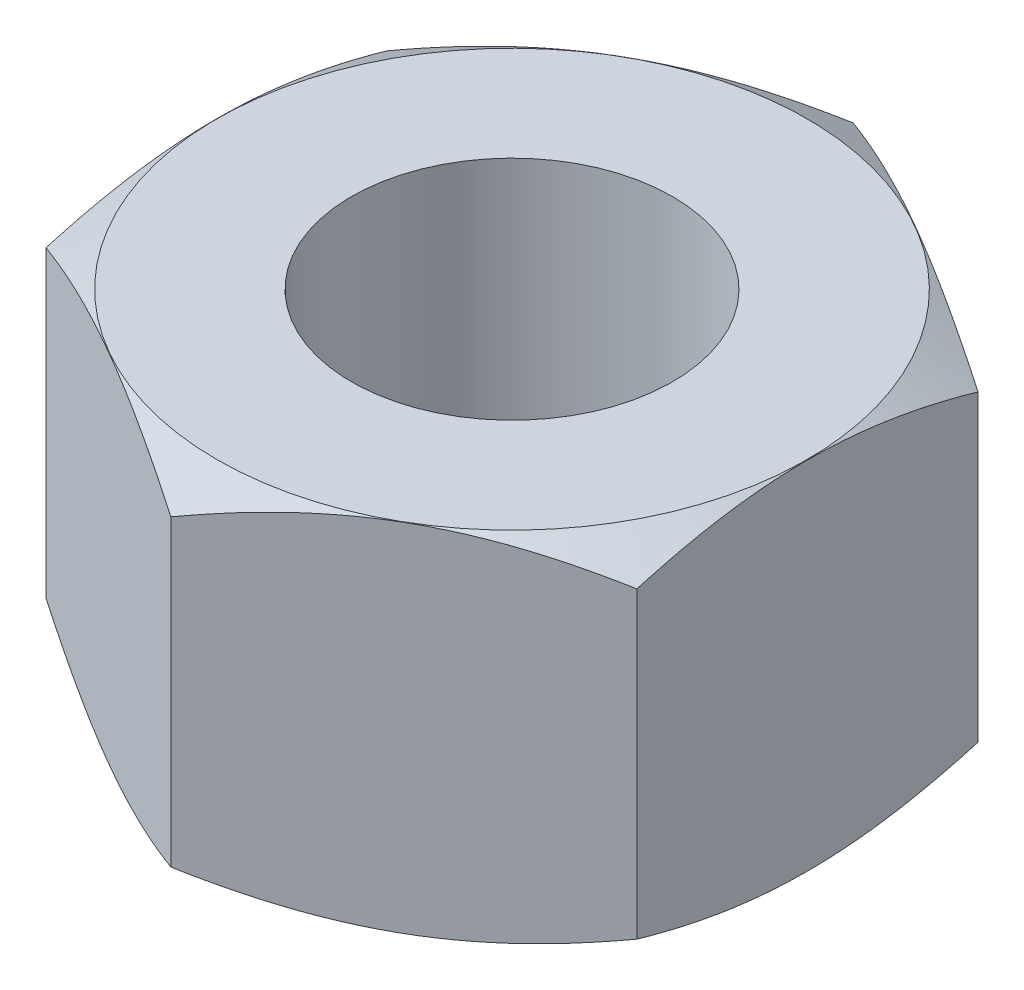
ISO-10303-21;
HEADER;
FILE_DESCRIPTION(('STEP AP214'),'2;1');
FILE_NAME('part.step','',(''),(''),'','','');
FILE_SCHEMA(('AUTOMOTIVE_DESIGN { 1 0 10303 214 1 1 1 1 }'));
ENDSEC;
DATA;
#1=APPLICATION_CONTEXT('core data for automotive mechanical design processes');
#2=APPLICATION_PROTOCOL_DEFINITION('international standard','automotive_design',2000,#1);
#3=PRODUCT_CONTEXT('',#1,'mechanical');
#4=PRODUCT('Part','Part','',(#3));
#5=PRODUCT_RELATED_PRODUCT_CATEGORY('part','',(#4));
#6=PRODUCT_DEFINITION_FORMATION('','',#4);
#7=PRODUCT_DEFINITION_CONTEXT('part definition',#1,'design');
#8=PRODUCT_DEFINITION('design','',#6,#7);
#9=PRODUCT_DEFINITION_SHAPE('','',#8);
#10=(LENGTH_UNIT() NAMED_UNIT(*) SI_UNIT(.MILLI.,.METRE.));
#11=(NAMED_UNIT(*) PLANE_ANGLE_UNIT() SI_UNIT($,.RADIAN.));
#12=(NAMED_UNIT(*) SI_UNIT($,.STERADIAN.) SOLID_ANGLE_UNIT());
#13=UNCERTAINTY_MEASURE_WITH_UNIT(LENGTH_MEASURE(1.E-05),#10,'distance_accuracy_value','');
#14=(GEOMETRIC_REPRESENTATION_CONTEXT(3) GLOBAL_UNCERTAINTY_ASSIGNED_CONTEXT((#13)) GLOBAL_UNIT_ASSIGNED_CONTEXT((#10,
#11,#12)) REPRESENTATION_CONTEXT('',''));
#15=CARTESIAN_POINT('',(0.,0.,0.));
#16=DIRECTION('',(0.,0.,1.));
#17=DIRECTION('',(1.,0.,0.));
#18=AXIS2_PLACEMENT_3D('',#15,#16,#17);
#19=CARTESIAN_POINT('',(0.,0.,0.));
#20=DIRECTION('',(0.,1.,0.));
#21=DIRECTION('',(0.,0.,1.));
#22=AXIS2_PLACEMENT_3D('',#19,#20,#21);
#23=CONICAL_SURFACE('',#22,7.7,1.0471975511966);
#24=CARTESIAN_POINT('',(0.,0.,0.));
#25=DIRECTION('',(0.,-1.,0.));
#26=DIRECTION('',(0.,0.,-1.));
#27=AXIS2_PLACEMENT_3D('',#24,#25,#26);
#28=CIRCLE('',#27,7.7);
#29=CARTESIAN_POINT('',(0.,0.,-7.7));
#30=VERTEX_POINT('',#29);
#31=EDGE_CURVE('E226',#30,#30,#28,.T.);
#32=ORIENTED_EDGE('',*,*,#31,.F.);
#33=EDGE_LOOP('',(#32));
#34=FACE_BOUND('',#33,.T.);
#35=CARTESIAN_POINT('',(-0.000200000000000209,0.692886990991615,-8.90011547005384));
#36=CARTESIAN_POINT('',(0.169222167899644,0.636421648760542,-8.80229953581029));
#37=CARTESIAN_POINT('',(0.339276001792091,0.582518917671602,-8.70411890903575));
#38=CARTESIAN_POINT('',(0.6807646868449,0.48054450654428,-8.5069603247953));
#39=CARTESIAN_POINT('',(0.852200100003986,0.432475341940828,-8.40798204285927));
#40=CARTESIAN_POINT('',(1.36925127631787,0.29796177962246,-8.10946240702964));
#41=CARTESIAN_POINT('',(1.71690807348494,0.221452160634334,-7.90874266159963));
#42=CARTESIAN_POINT('',(2.23716975291784,0.131735510096164,-7.60836944093));
#43=CARTESIAN_POINT('',(2.40822036386412,0.106177811090826,-7.50961332465511));
#44=CARTESIAN_POINT('',(2.75109513118736,0.063321833393041,-7.31165448544271));
#45=CARTESIAN_POINT('',(2.92291921786322,0.0460228249422022,-7.21245180274714));
#46=CARTESIAN_POINT('',(3.26686324908927,0.0201226451039089,-7.01387562373261));
#47=CARTESIAN_POINT('',(3.43898263481859,0.0115116028359858,-6.91450245004904));
#48=CARTESIAN_POINT('',(3.78338041287819,0.00317196678732889,-6.71566430017802));
#49=CARTESIAN_POINT('',(3.9556588001317,0.0034430985924934,-6.61619932692165));
#50=CARTESIAN_POINT('',(4.27773994586687,0.0122500453395684,-6.43024569073055));
#51=CARTESIAN_POINT('',(4.42756543182846,0.0197115208098528,-6.34374390607915));
#52=CARTESIAN_POINT('',(4.72686602512843,0.0412075728431838,-6.1709426279688));
#53=CARTESIAN_POINT('',(4.87634110685888,0.0552426156306021,-6.08464314929459));
#54=CARTESIAN_POINT('',(5.32418714905105,0.106876255042379,-5.82607911627943));
#55=CARTESIAN_POINT('',(5.62176538330737,0.153996930768511,-5.65427224262657));
#56=CARTESIAN_POINT('',(6.22007853959425,0.271799565487731,-5.30883598078465));
#57=CARTESIAN_POINT('',(6.52073710030243,0.342980894839996,-5.13525067982561));
#58=CARTESIAN_POINT('',(7.11757057411252,0.504533148507138,-4.79066871305998));
#59=CARTESIAN_POINT('',(7.4137531303935,0.594866127430669,-4.61966763446188));
#60=CARTESIAN_POINT('',(7.7078260936815,0.692886990991614,-4.44988452994616));
#61=B_SPLINE_CURVE_WITH_KNOTS('',3,(#35,#36,#37,#38,#39,#40,#41,#42,#43,#44,#45,#46,#47,#48,#49,
#50,#51,#52,#53,#54,#55,#56,#57,#58,#59,#60),.UNSPECIFIED.,.F.,.F.,(4,2,2,2,2,2,2,2,2,2,2,2,4),
(0.,0.610804246415455,1.22187094290096,2.44654344095257,3.04388117466782,3.64116611636473,
4.23777168271815,4.83435881700474,5.35372255660975,5.87312313720181,6.91266234673443,
7.97525670706933,9.03576508941966),.UNSPECIFIED.);
#62=CARTESIAN_POINT('',(0.,0.692820323027548,-8.9));
#63=VERTEX_POINT('',#62);
#64=CARTESIAN_POINT('',(7.7076260936815,0.692820323027549,-4.45));
#65=VERTEX_POINT('',#64);
#66=EDGE_CURVE('E91',#63,#65,#61,.T.);
#67=ORIENTED_EDGE('',*,*,#66,.T.);
#68=CARTESIAN_POINT('',(7.7076260936815,3.69241264911751,-11.8014451106687));
#69=CARTESIAN_POINT('',(7.7076260936815,3.52887986622969,-11.4630414887638));
#70=CARTESIAN_POINT('',(7.7076260936815,3.3669729208034,-11.1238377079909));
#71=CARTESIAN_POINT('',(7.7076260936815,3.04733978113838,-10.4433971593071));
#72=CARTESIAN_POINT('',(7.7076260936815,2.88961431089409,-10.1021600517051));
#73=CARTESIAN_POINT('',(7.7076260936815,2.57844215818103,-9.41537654310008));
#74=CARTESIAN_POINT('',(7.7076260936815,2.42502513245174,-9.06981665623875));
#75=CARTESIAN_POINT('',(7.7076260936815,2.12478158643834,-8.37585652400873));
#76=CARTESIAN_POINT('',(7.7076260936815,1.97795472256955,-8.02745642783886));
#77=CARTESIAN_POINT('',(7.7076260936815,1.69090202350008,-7.32293917269707));
#78=CARTESIAN_POINT('',(7.7076260936815,1.55077927487961,-6.9667797769286));
#79=CARTESIAN_POINT('',(7.7076260936815,1.28150958137545,-6.25026078017459));
#80=CARTESIAN_POINT('',(7.7076260936815,1.1523638577034,-5.88990071691609));
#81=CARTESIAN_POINT('',(7.7076260936815,0.908519279088907,-5.16514296841122));
#82=CARTESIAN_POINT('',(7.7076260936815,0.793789704835868,-4.80075573272563));
#83=CARTESIAN_POINT('',(7.7076260936815,0.582501973903968,-4.06681414162403));
#84=CARTESIAN_POINT('',(7.7076260936815,0.485938070152507,-3.6972614602836));
#85=CARTESIAN_POINT('',(7.7076260936815,0.315676961193567,-2.95267455951409));
#86=CARTESIAN_POINT('',(7.7076260936815,0.241985877049487,-2.57763890083715));
#87=CARTESIAN_POINT('',(7.7076260936815,0.152293998133902,-2.01178575991816));
#88=CARTESIAN_POINT('',(7.7076260936815,0.125868883431475,-1.82259488629562));
#89=CARTESIAN_POINT('',(7.7076260936815,0.0804868513507409,-1.4433263436088));
#90=CARTESIAN_POINT('',(7.7076260936815,0.0615291946454162,-1.25324876422057));
#91=CARTESIAN_POINT('',(7.7076260936815,0.0315922241749611,-0.873669165556705));
#92=CARTESIAN_POINT('',(7.7076260936815,0.0205633829760341,-0.68417106826483));
#93=CARTESIAN_POINT('',(7.7076260936815,0.00654234367085251,-0.304877883909034));
#94=CARTESIAN_POINT('',(7.7076260936815,0.00355004126504763,-0.115082800731434));
#95=CARTESIAN_POINT('',(7.7076260936815,0.00567337685537349,0.26440937703419));
#96=CARTESIAN_POINT('',(7.7076260936815,0.0107867401344757,0.454106484174179));
#97=CARTESIAN_POINT('',(7.7076260936815,0.0289942688970697,0.833119850132486));
#98=CARTESIAN_POINT('',(7.7076260936815,0.0420888327037642,1.02243608946942));
#99=CARTESIAN_POINT('',(7.7076260936815,0.0832268522752309,1.48129998203514));
#100=CARTESIAN_POINT('',(7.7076260936815,0.115270270522412,1.75049490260385));
#101=CARTESIAN_POINT('',(7.7076260936815,0.193715361207477,2.2868215142369));
#102=CARTESIAN_POINT('',(7.7076260936815,0.240120953171638,2.5539526216514));
#103=CARTESIAN_POINT('',(7.7076260936815,0.345644526759552,3.08593136598957));
#104=CARTESIAN_POINT('',(7.7076260936815,0.404774529542571,3.3507765955656));
#105=CARTESIAN_POINT('',(7.7076260936815,0.533942833656262,3.87774198044864));
#106=CARTESIAN_POINT('',(7.7076260936815,0.603980107299928,4.13986239000966));
#107=CARTESIAN_POINT('',(7.7076260936815,0.755117951796345,4.66783325817358));
#108=CARTESIAN_POINT('',(7.7076260936815,0.836447598500233,4.93361768761922));
#109=CARTESIAN_POINT('',(7.7076260936815,1.0071414293717,5.46237718554669));
#110=CARTESIAN_POINT('',(7.7076260936815,1.09650007130802,5.72535405385152));
#111=CARTESIAN_POINT('',(7.7076260936815,1.2814062113372,6.24744318728047));
#112=CARTESIAN_POINT('',(7.7076260936815,1.3769160410466,6.50656887365599));
#113=CARTESIAN_POINT('',(7.7076260936815,1.57354074367965,7.02280990118339));
#114=CARTESIAN_POINT('',(7.7076260936815,1.67465788248558,7.27992438101968));
#115=CARTESIAN_POINT('',(7.7076260936815,1.7780239607159,7.53610484965381));
#116=B_SPLINE_CURVE_WITH_KNOTS('',3,(#68,#69,#70,#71,#72,#73,#74,#75,#76,#77,#78,#79,#80,#81,
#82,#83,#84,#85,#86,#87,#88,#89,#90,#91,#92,#93,#94,#95,#96,#97,#98,#99,#100,#101,#102,#103,
#104,#105,#106,#107,#108,#109,#110,#111,#112,#113,#114,#115),.UNSPECIFIED.,.F.,.F.,(4,2,2,2,2,2,
2,2,2,2,2,2,2,2,2,2,2,2,2,2,2,2,2,4),(0.,1.12755219422506,2.2552983581379,3.38949922455345,
4.52364088941895,5.671696999624,6.81988066619319,7.96557461474846,9.1109054883236,
10.2565426035655,10.8295005906253,11.4024018368429,11.9716925984265,12.5409759716233,
13.1100996134175,13.6792516611785,14.4920847267267,15.3051398153559,16.1189664220592,
16.9327163960647,17.7664101699015,18.5995328214193,19.4279658340642,20.2567360865109),.UNSPECIFIED.);
#117=CARTESIAN_POINT('',(7.7076260936815,0.69282032302755,4.45));
#118=VERTEX_POINT('',#117);
#119=EDGE_CURVE('E190',#65,#118,#116,.T.);
#120=ORIENTED_EDGE('',*,*,#119,.T.);
#121=CARTESIAN_POINT('',(7.7078260936815,0.692886990991616,4.44988452994617));
#122=CARTESIAN_POINT('',(7.53840392578186,0.636421648760543,4.54770046418971));
#123=CARTESIAN_POINT('',(7.36835009188941,0.582518917671603,4.64588109096425));
#124=CARTESIAN_POINT('',(7.0268614068366,0.480544506544282,4.8430396752047));
#125=CARTESIAN_POINT('',(6.85542599367752,0.43247534194083,4.94201795714073));
#126=CARTESIAN_POINT('',(6.33837481736364,0.297961779622461,5.24053759297036));
#127=CARTESIAN_POINT('',(5.99071802019657,0.221452160634334,5.44125733840037));
#128=CARTESIAN_POINT('',(5.47045634076367,0.131735510096165,5.74163055907));
#129=CARTESIAN_POINT('',(5.29940572981738,0.106177811090828,5.84038667534489));
#130=CARTESIAN_POINT('',(4.95653096249414,0.0633218333930435,6.0383455145573));
#131=CARTESIAN_POINT('',(4.78470687581828,0.0460228249422039,6.13754819725286));
#132=CARTESIAN_POINT('',(4.44076284459223,0.0201226451039102,6.33612437626739));
#133=CARTESIAN_POINT('',(4.26864345886291,0.0115116028359876,6.43549754995096));
#134=CARTESIAN_POINT('',(3.92424568080331,0.00317196678733112,6.63433569982198));
#135=CARTESIAN_POINT('',(3.75196729354981,0.00344309859249552,6.73380067307835));
#136=CARTESIAN_POINT('',(3.42988614781463,0.0122500453395703,6.91975430926946));
#137=CARTESIAN_POINT('',(3.28006066185304,0.0197115208098546,7.00625609392085));
#138=CARTESIAN_POINT('',(2.98076006855307,0.0412075728431853,7.1790573720312));
#139=CARTESIAN_POINT('',(2.83128498682262,0.0552426156306034,7.26535685070541));
#140=CARTESIAN_POINT('',(2.38343894463045,0.10687625504238,7.52392088372057));
#141=CARTESIAN_POINT('',(2.08586071037413,0.153996930768512,7.69572775737343));
#142=CARTESIAN_POINT('',(1.48754755408726,0.271799565487733,8.04116401921535));
#143=CARTESIAN_POINT('',(1.18688899337908,0.342980894839997,8.21474932017439));
#144=CARTESIAN_POINT('',(0.590055519568988,0.504533148507138,8.55933128694002));
#145=CARTESIAN_POINT('',(0.293872963288004,0.594866127430669,8.73033236553812));
#146=CARTESIAN_POINT('',(-0.000199999999995418,0.692886990991615,8.90011547005384));
#147=B_SPLINE_CURVE_WITH_KNOTS('',3,(#121,#122,#123,#124,#125,#126,#127,#128,#129,#130,#131,
#132,#133,#134,#135,#136,#137,#138,#139,#140,#141,#142,#143,#144,#145,#146),.UNSPECIFIED.,.F.,
.F.,(4,2,2,2,2,2,2,2,2,2,2,2,4),(0.,0.610804246415454,1.22187094290096,2.44654344095257,
3.04388117466782,3.64116611636473,4.23777168271816,4.83435881700474,5.35372255660975,
5.87312313720181,6.91266234673443,7.97525670706933,9.03576508941965),.UNSPECIFIED.);
#148=CARTESIAN_POINT('',(0.,0.692820323027549,8.9));
#149=VERTEX_POINT('',#148);
#150=EDGE_CURVE('E183',#118,#149,#147,.T.);
#151=ORIENTED_EDGE('',*,*,#150,.T.);
#152=CARTESIAN_POINT('',(0.000200000000003903,0.692886990991616,8.90011547005384));
#153=CARTESIAN_POINT('',(-0.16922216789964,0.636421648760543,8.80229953581029));
#154=CARTESIAN_POINT('',(-0.339276001792088,0.582518917671602,8.70411890903576));
#155=CARTESIAN_POINT('',(-0.680764686844897,0.480544506544281,8.5069603247953));
#156=CARTESIAN_POINT('',(-0.852200100003983,0.432475341940829,8.40798204285927));
#157=CARTESIAN_POINT('',(-1.36925127631786,0.29796177962246,8.10946240702964));
#158=CARTESIAN_POINT('',(-1.71690807348493,0.221452160634332,7.90874266159963));
#159=CARTESIAN_POINT('',(-2.23716975291783,0.131735510096163,7.60836944093));
#160=CARTESIAN_POINT('',(-2.40822036386412,0.106177811090826,7.50961332465511));
#161=CARTESIAN_POINT('',(-2.75109513118736,0.0633218333930418,7.31165448544271));
#162=CARTESIAN_POINT('',(-2.92291921786321,0.0460228249422021,7.21245180274714));
#163=CARTESIAN_POINT('',(-3.26686324908927,0.0201226451039084,7.01387562373261));
#164=CARTESIAN_POINT('',(-3.43898263481859,0.0115116028359858,6.91450245004904));
#165=CARTESIAN_POINT('',(-3.78338041287819,0.00317196678732892,6.71566430017802));
#166=CARTESIAN_POINT('',(-3.95565880013169,0.00344309859249301,6.61619932692165));
#167=CARTESIAN_POINT('',(-4.27773994586687,0.0122500453395676,6.43024569073055));
#168=CARTESIAN_POINT('',(-4.42756543182846,0.0197115208098519,6.34374390607916));
#169=CARTESIAN_POINT('',(-4.72686602512843,0.041207572843183,6.1709426279688));
#170=CARTESIAN_POINT('',(-4.87634110685888,0.0552426156306014,6.08464314929459));
#171=CARTESIAN_POINT('',(-5.32418714905105,0.106876255042379,5.82607911627943));
#172=CARTESIAN_POINT('',(-5.62176538330737,0.15399693076851,5.65427224262657));
#173=CARTESIAN_POINT('',(-6.22007853959424,0.27179956548773,5.30883598078465));
#174=CARTESIAN_POINT('',(-6.52073710030242,0.342980894839995,5.13525067982561));
#175=CARTESIAN_POINT('',(-7.11757057411251,0.504533148507137,4.79066871305998));
#176=CARTESIAN_POINT('',(-7.4137531303935,0.594866127430668,4.61966763446188));
#177=CARTESIAN_POINT('',(-7.7078260936815,0.692886990991613,4.44988452994616));
#178=B_SPLINE_CURVE_WITH_KNOTS('',3,(#152,#153,#154,#155,#156,#157,#158,#159,#160,#161,#162,
#163,#164,#165,#166,#167,#168,#169,#170,#171,#172,#173,#174,#175,#176,#177),.UNSPECIFIED.,.F.,
.F.,(4,2,2,2,2,2,2,2,2,2,2,2,4),(0.,0.610804246415455,1.22187094290096,2.44654344095257,
3.04388117466782,3.64116611636473,4.23777168271815,4.83435881700474,5.35372255660975,
5.87312313720182,6.91266234673444,7.97525670706934,9.03576508941966),.UNSPECIFIED.);
#179=CARTESIAN_POINT('',(-7.7076260936815,0.692820323027548,4.45));
#180=VERTEX_POINT('',#179);
#181=EDGE_CURVE('E112',#149,#180,#178,.T.);
#182=ORIENTED_EDGE('',*,*,#181,.T.);
#183=CARTESIAN_POINT('',(-7.70762609368151,3.69241264911751,-11.8014451106687));
#184=CARTESIAN_POINT('',(-7.7076260936815,3.52887986622969,-11.4630414887638));
#185=CARTESIAN_POINT('',(-7.7076260936815,3.3669729208034,-11.1238377079909));
#186=CARTESIAN_POINT('',(-7.7076260936815,3.04733978113838,-10.4433971593071));
#187=CARTESIAN_POINT('',(-7.7076260936815,2.8896143108941,-10.1021600517051));
#188=CARTESIAN_POINT('',(-7.7076260936815,2.57844215818103,-9.41537654310008));
#189=CARTESIAN_POINT('',(-7.7076260936815,2.42502513245174,-9.06981665623876));
#190=CARTESIAN_POINT('',(-7.7076260936815,2.12478158643835,-8.37585652400873));
#191=CARTESIAN_POINT('',(-7.7076260936815,1.97795472256955,-8.02745642783887));
#192=CARTESIAN_POINT('',(-7.7076260936815,1.69090202350008,-7.32293917269707));
#193=CARTESIAN_POINT('',(-7.7076260936815,1.55077927487961,-6.9667797769286));
#194=CARTESIAN_POINT('',(-7.7076260936815,1.28150958137545,-6.25026078017459));
#195=CARTESIAN_POINT('',(-7.7076260936815,1.1523638577034,-5.8899007169161));
#196=CARTESIAN_POINT('',(-7.7076260936815,0.908519279088908,-5.16514296841122));
#197=CARTESIAN_POINT('',(-7.7076260936815,0.793789704835868,-4.80075573272563));
#198=CARTESIAN_POINT('',(-7.7076260936815,0.582501973903968,-4.06681414162403));
#199=CARTESIAN_POINT('',(-7.7076260936815,0.485938070152507,-3.6972614602836));
#200=CARTESIAN_POINT('',(-7.7076260936815,0.315676961193568,-2.95267455951409));
#201=CARTESIAN_POINT('',(-7.7076260936815,0.241985877049488,-2.57763890083715));
#202=CARTESIAN_POINT('',(-7.7076260936815,0.152293998133903,-2.01178575991816));
#203=CARTESIAN_POINT('',(-7.7076260936815,0.125868883431476,-1.82259488629562));
#204=CARTESIAN_POINT('',(-7.7076260936815,0.0804868513507409,-1.4433263436088));
#205=CARTESIAN_POINT('',(-7.7076260936815,0.0615291946454161,-1.25324876422057));
#206=CARTESIAN_POINT('',(-7.7076260936815,0.031592224174961,-0.873669165556703));
#207=CARTESIAN_POINT('',(-7.7076260936815,0.020563382976034,-0.684171068264828));
#208=CARTESIAN_POINT('',(-7.7076260936815,0.00654234367085233,-0.304877883909033));
#209=CARTESIAN_POINT('',(-7.7076260936815,0.00355004126504741,-0.115082800731433));
#210=CARTESIAN_POINT('',(-7.7076260936815,0.00567337685537319,0.26440937703419));
#211=CARTESIAN_POINT('',(-7.7076260936815,0.0107867401344754,0.454106484174179));
#212=CARTESIAN_POINT('',(-7.7076260936815,0.0289942688970693,0.833119850132485));
#213=CARTESIAN_POINT('',(-7.7076260936815,0.0420888327037637,1.02243608946942));
#214=CARTESIAN_POINT('',(-7.7076260936815,0.0832268522752303,1.48129998203514));
#215=CARTESIAN_POINT('',(-7.7076260936815,0.115270270522412,1.75049490260385));
#216=CARTESIAN_POINT('',(-7.7076260936815,0.193715361207477,2.2868215142369));
#217=CARTESIAN_POINT('',(-7.7076260936815,0.240120953171637,2.55395262165139));
#218=CARTESIAN_POINT('',(-7.7076260936815,0.345644526759552,3.08593136598957));
#219=CARTESIAN_POINT('',(-7.7076260936815,0.40477452954257,3.3507765955656));
#220=CARTESIAN_POINT('',(-7.7076260936815,0.533942833656261,3.87774198044864));
#221=CARTESIAN_POINT('',(-7.7076260936815,0.603980107299927,4.13986239000965));
#222=CARTESIAN_POINT('',(-7.7076260936815,0.755117951796345,4.66783325817359));
#223=CARTESIAN_POINT('',(-7.7076260936815,0.836447598500234,4.93361768761922));
#224=CARTESIAN_POINT('',(-7.7076260936815,1.0071414293717,5.4623771855467));
#225=CARTESIAN_POINT('',(-7.7076260936815,1.09650007130802,5.72535405385153));
#226=CARTESIAN_POINT('',(-7.7076260936815,1.2814062113372,6.24744318728047));
#227=CARTESIAN_POINT('',(-7.7076260936815,1.3769160410466,6.506568873656));
#228=CARTESIAN_POINT('',(-7.7076260936815,1.57354074367965,7.02280990118339));
#229=CARTESIAN_POINT('',(-7.7076260936815,1.67465788248558,7.27992438101968));
#230=CARTESIAN_POINT('',(-7.7076260936815,1.7780239607159,7.53610484965381));
#231=B_SPLINE_CURVE_WITH_KNOTS('',3,(#183,#184,#185,#186,#187,#188,#189,#190,#191,#192,#193,
#194,#195,#196,#197,#198,#199,#200,#201,#202,#203,#204,#205,#206,#207,#208,#209,#210,#211,#212,
#213,#214,#215,#216,#217,#218,#219,#220,#221,#222,#223,#224,#225,#226,#227,#228,#229,#230),
.UNSPECIFIED.,.F.,.F.,(4,2,2,2,2,2,2,2,2,2,2,2,2,2,2,2,2,2,2,2,2,2,2,4),(0.,1.12755219422506,
2.2552983581379,3.38949922455345,4.52364088941894,5.67169699962399,6.81988066619319,
7.96557461474846,9.1109054883236,10.2565426035655,10.8295005906253,11.4024018368429,
11.9716925984265,12.5409759716233,13.1100996134175,13.6792516611785,14.4920847267267,
15.3051398153559,16.1189664220592,16.9327163960647,17.7664101699015,18.5995328214193,
19.4279658340642,20.2567360865109),.UNSPECIFIED.);
#232=CARTESIAN_POINT('',(-7.7076260936815,0.692820323027549,-4.45));
#233=VERTEX_POINT('',#232);
#234=EDGE_CURVE('E110',#180,#233,#231,.F.);
#235=ORIENTED_EDGE('',*,*,#234,.T.);
#236=CARTESIAN_POINT('',(-7.7078260936815,0.692886990991616,-4.44988452994616));
#237=CARTESIAN_POINT('',(-7.53840392578186,0.636421648760543,-4.54770046418971));
#238=CARTESIAN_POINT('',(-7.36835009188941,0.582518917671602,-4.64588109096424));
#239=CARTESIAN_POINT('',(-7.0268614068366,0.480544506544281,-4.84303967520469));
#240=CARTESIAN_POINT('',(-6.85542599367752,0.43247534194083,-4.94201795714073));
#241=CARTESIAN_POINT('',(-6.33837481736364,0.297961779622462,-5.24053759297036));
#242=CARTESIAN_POINT('',(-5.99071802019657,0.221452160634334,-5.44125733840037));
#243=CARTESIAN_POINT('',(-5.47045634076367,0.131735510096164,-5.74163055907));
#244=CARTESIAN_POINT('',(-5.29940572981738,0.106177811090827,-5.84038667534489));
#245=CARTESIAN_POINT('',(-4.95653096249414,0.0633218333930416,-6.03834551455729));
#246=CARTESIAN_POINT('',(-4.78470687581828,0.0460228249422022,-6.13754819725286));
#247=CARTESIAN_POINT('',(-4.44076284459223,0.0201226451039089,-6.33612437626739));
#248=CARTESIAN_POINT('',(-4.26864345886291,0.0115116028359867,-6.43549754995096));
#249=CARTESIAN_POINT('',(-3.92424568080331,0.00317196678733007,-6.63433569982198));
#250=CARTESIAN_POINT('',(-3.75196729354981,0.00344309859249415,-6.73380067307835));
#251=CARTESIAN_POINT('',(-3.42988614781463,0.0122500453395687,-6.91975430926945));
#252=CARTESIAN_POINT('',(-3.28006066185304,0.019711520809853,-7.00625609392084));
#253=CARTESIAN_POINT('',(-2.98076006855307,0.0412075728431836,-7.1790573720312));
#254=CARTESIAN_POINT('',(-2.83128498682262,0.0552426156306016,-7.26535685070541));
#255=CARTESIAN_POINT('',(-2.38343894463045,0.106876255042379,-7.52392088372057));
#256=CARTESIAN_POINT('',(-2.08586071037413,0.15399693076851,-7.69572775737343));
#257=CARTESIAN_POINT('',(-1.48754755408726,0.271799565487731,-8.04116401921535));
#258=CARTESIAN_POINT('',(-1.18688899337908,0.342980894839996,-8.21474932017439));
#259=CARTESIAN_POINT('',(-0.590055519568985,0.504533148507137,-8.55933128694002));
#260=CARTESIAN_POINT('',(-0.293872963288,0.594866127430668,-8.73033236553812));
#261=CARTESIAN_POINT('',(0.000199999999999285,0.692886990991615,-8.90011547005384));
#262=B_SPLINE_CURVE_WITH_KNOTS('',3,(#236,#237,#238,#239,#240,#241,#242,#243,#244,#245,#246,
#247,#248,#249,#250,#251,#252,#253,#254,#255,#256,#257,#258,#259,#260,#261),.UNSPECIFIED.,.F.,
.F.,(4,2,2,2,2,2,2,2,2,2,2,2,4),(0.,0.610804246415454,1.22187094290096,2.44654344095257,
3.04388117466782,3.64116611636474,4.23777168271816,4.83435881700474,5.35372255660975,
5.87312313720182,6.91266234673443,7.97525670706934,9.03576508941966),.UNSPECIFIED.);
#263=EDGE_CURVE('E96',#233,#63,#262,.T.);
#264=ORIENTED_EDGE('',*,*,#263,.T.);
#265=EDGE_LOOP('',(#67,#120,#151,#182,#235,#264));
#266=FACE_BOUND('',#265,.T.);
#267=ADVANCED_FACE('F35',(#34,#266),#23,.T.);
#268=CARTESIAN_POINT('',(0.,8.60717967697245,0.));
#269=DIRECTION('',(0.,-1.,0.));
#270=DIRECTION('',(0.,0.,-1.));
#271=AXIS2_PLACEMENT_3D('',#268,#269,#270);
#272=CONICAL_SURFACE('',#271,8.9,1.0471975511966);
#273=CARTESIAN_POINT('',(0.,9.3,0.));
#274=DIRECTION('',(0.,1.,0.));
#275=DIRECTION('',(0.,0.,1.));
#276=AXIS2_PLACEMENT_3D('',#273,#274,#275);
#277=CIRCLE('',#276,7.69999999999999);
#278=CARTESIAN_POINT('',(0.,9.3,7.69999999999999));
#279=VERTEX_POINT('',#278);
#280=EDGE_CURVE('E227',#279,#279,#277,.T.);
#281=ORIENTED_EDGE('',*,*,#280,.F.);
#282=EDGE_LOOP('',(#281));
#283=FACE_BOUND('',#282,.T.);
#284=CARTESIAN_POINT('',(-0.000199999999996097,8.60711300900839,8.90011547005384));
#285=CARTESIAN_POINT('',(0.169222167899648,8.66357835123946,8.80229953581029));
#286=CARTESIAN_POINT('',(0.339276001792095,8.7174810823284,8.70411890903576));
#287=CARTESIAN_POINT('',(0.680764686844904,8.81945549345572,8.50696032479531));
#288=CARTESIAN_POINT('',(0.85220010000399,8.86752465805917,8.40798204285927));
#289=CARTESIAN_POINT('',(1.36925127631787,9.00203822037754,8.10946240702964));
#290=CARTESIAN_POINT('',(1.71690807348494,9.07854783936567,7.90874266159963));
#291=CARTESIAN_POINT('',(2.23716975291784,9.16826448990383,7.60836944093));
#292=CARTESIAN_POINT('',(2.40822036386413,9.19382218890917,7.50961332465511));
#293=CARTESIAN_POINT('',(2.75109513118736,9.23667816660696,7.31165448544271));
#294=CARTESIAN_POINT('',(2.92291921786322,9.2539771750578,7.21245180274714));
#295=CARTESIAN_POINT('',(3.26686324908928,9.27987735489609,7.01387562373261));
#296=CARTESIAN_POINT('',(3.43898263481859,9.28848839716401,6.91450245004904));
#297=CARTESIAN_POINT('',(3.7833804128782,9.29682803321267,6.71566430017802));
#298=CARTESIAN_POINT('',(3.9556588001317,9.29655690140751,6.61619932692165));
#299=CARTESIAN_POINT('',(4.27773994586687,9.28774995466043,6.43024569073055));
#300=CARTESIAN_POINT('',(4.42756543182846,9.28028847919015,6.34374390607916));
#301=CARTESIAN_POINT('',(4.72686602512844,9.25879242715681,6.1709426279688));
#302=CARTESIAN_POINT('',(4.87634110685888,9.2447573843694,6.08464314929459));
#303=CARTESIAN_POINT('',(5.32418714905106,9.19312374495762,5.82607911627943));
#304=CARTESIAN_POINT('',(5.62176538330737,9.14600306923149,5.65427224262657));
#305=CARTESIAN_POINT('',(6.22007853959425,9.02820043451227,5.30883598078465));
#306=CARTESIAN_POINT('',(6.52073710030243,8.95701910516,5.13525067982562));
#307=CARTESIAN_POINT('',(7.11757057411252,8.79546685149286,4.79066871305998));
#308=CARTESIAN_POINT('',(7.4137531303935,8.70513387256933,4.61966763446188));
#309=CARTESIAN_POINT('',(7.7078260936815,8.60711300900839,4.44988452994616));
#310=B_SPLINE_CURVE_WITH_KNOTS('',3,(#284,#285,#286,#287,#288,#289,#290,#291,#292,#293,#294,
#295,#296,#297,#298,#299,#300,#301,#302,#303,#304,#305,#306,#307,#308,#309),.UNSPECIFIED.,.F.,
.F.,(4,2,2,2,2,2,2,2,2,2,2,2,4),(0.,0.610804246415454,1.22187094290096,2.44654344095257,
3.04388117466782,3.64116611636473,4.23777168271816,4.83435881700474,5.35372255660975,
5.87312313720181,6.91266234673443,7.97525670706933,9.03576508941965),.UNSPECIFIED.);
#311=CARTESIAN_POINT('',(0.,8.60717967697245,8.9));
#312=VERTEX_POINT('',#311);
#313=CARTESIAN_POINT('',(7.7076260936815,8.60717967697245,4.45));
#314=VERTEX_POINT('',#313);
#315=EDGE_CURVE('E49',#312,#314,#310,.T.);
#316=ORIENTED_EDGE('',*,*,#315,.T.);
#317=CARTESIAN_POINT('',(7.7076260936815,5.6075873508825,-11.8014451106687));
#318=CARTESIAN_POINT('',(7.7076260936815,5.77112013377031,-11.4630414887638));
#319=CARTESIAN_POINT('',(7.7076260936815,5.93302707919661,-11.1238377079909));
#320=CARTESIAN_POINT('',(7.7076260936815,6.25266021886163,-10.4433971593071));
#321=CARTESIAN_POINT('',(7.7076260936815,6.41038568910591,-10.1021600517051));
#322=CARTESIAN_POINT('',(7.7076260936815,6.72155784181898,-9.41537654310008));
#323=CARTESIAN_POINT('',(7.7076260936815,6.87497486754827,-9.06981665623875));
#324=CARTESIAN_POINT('',(7.7076260936815,7.17521841356166,-8.37585652400873));
#325=CARTESIAN_POINT('',(7.7076260936815,7.32204527743045,-8.02745642783886));
#326=CARTESIAN_POINT('',(7.7076260936815,7.60909797649992,-7.32293917269706));
#327=CARTESIAN_POINT('',(7.7076260936815,7.74922072512039,-6.9667797769286));
#328=CARTESIAN_POINT('',(7.7076260936815,8.01849041862455,-6.25026078017459));
#329=CARTESIAN_POINT('',(7.7076260936815,8.14763614229661,-5.88990071691609));
#330=CARTESIAN_POINT('',(7.7076260936815,8.39148072091109,-5.16514296841122));
#331=CARTESIAN_POINT('',(7.7076260936815,8.50621029516413,-4.80075573272563));
#332=CARTESIAN_POINT('',(7.7076260936815,8.71749802609603,-4.06681414162403));
#333=CARTESIAN_POINT('',(7.7076260936815,8.81406192984749,-3.6972614602836));
#334=CARTESIAN_POINT('',(7.7076260936815,8.98432303880643,-2.95267455951409));
#335=CARTESIAN_POINT('',(7.7076260936815,9.05801412295051,-2.57763890083715));
#336=CARTESIAN_POINT('',(7.7076260936815,9.1477060018661,-2.01178575991816));
#337=CARTESIAN_POINT('',(7.7076260936815,9.17413111656853,-1.82259488629562));
#338=CARTESIAN_POINT('',(7.7076260936815,9.21951314864926,-1.4433263436088));
#339=CARTESIAN_POINT('',(7.7076260936815,9.23847080535458,-1.25324876422057));
#340=CARTESIAN_POINT('',(7.7076260936815,9.26840777582504,-0.873669165556706));
#341=CARTESIAN_POINT('',(7.7076260936815,9.27943661702396,-0.684171068264831));
#342=CARTESIAN_POINT('',(7.7076260936815,9.29345765632915,-0.304877883909036));
#343=CARTESIAN_POINT('',(7.7076260936815,9.29644995873495,-0.115082800731435));
#344=CARTESIAN_POINT('',(7.7076260936815,9.29432662314463,0.264409377034188));
#345=CARTESIAN_POINT('',(7.7076260936815,9.28921325986552,0.454106484174178));
#346=CARTESIAN_POINT('',(7.7076260936815,9.27100573110293,0.833119850132485));
#347=CARTESIAN_POINT('',(7.7076260936815,9.25791116729624,1.02243608946942));
#348=CARTESIAN_POINT('',(7.7076260936815,9.21677314772477,1.48129998203514));
#349=CARTESIAN_POINT('',(7.7076260936815,9.18472972947759,1.75049490260385));
#350=CARTESIAN_POINT('',(7.7076260936815,9.10628463879252,2.2868215142369));
#351=CARTESIAN_POINT('',(7.7076260936815,9.05987904682836,2.5539526216514));
#352=CARTESIAN_POINT('',(7.7076260936815,8.95435547324045,3.08593136598958));
#353=CARTESIAN_POINT('',(7.7076260936815,8.89522547045743,3.3507765955656));
#354=CARTESIAN_POINT('',(7.7076260936815,8.76605716634374,3.87774198044865));
#355=CARTESIAN_POINT('',(7.7076260936815,8.69601989270007,4.13986239000966));
#356=CARTESIAN_POINT('',(7.7076260936815,8.54488204820365,4.66783325817359));
#357=CARTESIAN_POINT('',(7.7076260936815,8.46355240149976,4.93361768761923));
#358=CARTESIAN_POINT('',(7.7076260936815,8.29285857062829,5.4623771855467));
#359=CARTESIAN_POINT('',(7.7076260936815,8.20349992869198,5.72535405385153));
#360=CARTESIAN_POINT('',(7.7076260936815,8.0185937886628,6.24744318728048));
#361=CARTESIAN_POINT('',(7.7076260936815,7.9230839589534,6.50656887365601));
#362=CARTESIAN_POINT('',(7.7076260936815,7.72645925632035,7.0228099011834));
#363=CARTESIAN_POINT('',(7.7076260936815,7.62534211751442,7.27992438101969));
#364=CARTESIAN_POINT('',(7.7076260936815,7.52197603928409,7.53610484965382));
#365=B_SPLINE_CURVE_WITH_KNOTS('',3,(#317,#318,#319,#320,#321,#322,#323,#324,#325,#326,#327,
#328,#329,#330,#331,#332,#333,#334,#335,#336,#337,#338,#339,#340,#341,#342,#343,#344,#345,#346,
#347,#348,#349,#350,#351,#352,#353,#354,#355,#356,#357,#358,#359,#360,#361,#362,#363,#364),
.UNSPECIFIED.,.F.,.F.,(4,2,2,2,2,2,2,2,2,2,2,2,2,2,2,2,2,2,2,2,2,2,2,4),(0.,1.12755219422506,
2.2552983581379,3.38949922455345,4.52364088941895,5.671696999624,6.81988066619319,
7.96557461474846,9.11090548832359,10.2565426035655,10.8295005906253,11.4024018368429,
11.9716925984265,12.5409759716233,13.1100996134175,13.6792516611785,14.4920847267267,
15.3051398153559,16.1189664220592,16.9327163960647,17.7664101699015,18.5995328214193,
19.4279658340642,20.2567360865109),.UNSPECIFIED.);
#366=CARTESIAN_POINT('',(7.7076260936815,8.60717967697245,-4.45));
#367=VERTEX_POINT('',#366);
#368=EDGE_CURVE('E12',#314,#367,#365,.F.);
#369=ORIENTED_EDGE('',*,*,#368,.T.);
#370=CARTESIAN_POINT('',(7.7078260936815,8.60711300900839,-4.44988452994616));
#371=CARTESIAN_POINT('',(7.53840392578186,8.66357835123946,-4.54770046418971));
#372=CARTESIAN_POINT('',(7.36835009188941,8.7174810823284,-4.64588109096424));
#373=CARTESIAN_POINT('',(7.0268614068366,8.81945549345572,-4.84303967520469));
#374=CARTESIAN_POINT('',(6.85542599367752,8.86752465805917,-4.94201795714073));
#375=CARTESIAN_POINT('',(6.33837481736364,9.00203822037754,-5.24053759297036));
#376=CARTESIAN_POINT('',(5.99071802019657,9.07854783936567,-5.44125733840037));
#377=CARTESIAN_POINT('',(5.47045634076367,9.16826448990384,-5.74163055907));
#378=CARTESIAN_POINT('',(5.29940572981738,9.19382218890917,-5.84038667534489));
#379=CARTESIAN_POINT('',(4.95653096249414,9.23667816660696,-6.03834551455729));
#380=CARTESIAN_POINT('',(4.78470687581829,9.2539771750578,-6.13754819725286));
#381=CARTESIAN_POINT('',(4.44076284459223,9.27987735489609,-6.33612437626739));
#382=CARTESIAN_POINT('',(4.26864345886291,9.28848839716401,-6.43549754995096));
#383=CARTESIAN_POINT('',(3.92424568080331,9.29682803321267,-6.63433569982198));
#384=CARTESIAN_POINT('',(3.75196729354981,9.29655690140751,-6.73380067307835));
#385=CARTESIAN_POINT('',(3.42988614781463,9.28774995466043,-6.91975430926945));
#386=CARTESIAN_POINT('',(3.28006066185304,9.28028847919015,-7.00625609392084));
#387=CARTESIAN_POINT('',(2.98076006855307,9.25879242715682,-7.1790573720312));
#388=CARTESIAN_POINT('',(2.83128498682262,9.2447573843694,-7.26535685070541));
#389=CARTESIAN_POINT('',(2.38343894463045,9.19312374495762,-7.52392088372057));
#390=CARTESIAN_POINT('',(2.08586071037413,9.14600306923149,-7.69572775737343));
#391=CARTESIAN_POINT('',(1.48754755408726,9.02820043451227,-8.04116401921535));
#392=CARTESIAN_POINT('',(1.18688899337907,8.95701910516,-8.21474932017439));
#393=CARTESIAN_POINT('',(0.590055519568985,8.79546685149286,-8.55933128694002));
#394=CARTESIAN_POINT('',(0.293872963288,8.70513387256933,-8.73033236553812));
#395=CARTESIAN_POINT('',(-0.000199999999999588,8.60711300900839,-8.90011547005384));
#396=B_SPLINE_CURVE_WITH_KNOTS('',3,(#370,#371,#372,#373,#374,#375,#376,#377,#378,#379,#380,
#381,#382,#383,#384,#385,#386,#387,#388,#389,#390,#391,#392,#393,#394,#395),.UNSPECIFIED.,.F.,
.F.,(4,2,2,2,2,2,2,2,2,2,2,2,4),(0.,0.610804246415453,1.22187094290096,2.44654344095257,
3.04388117466782,3.64116611636473,4.23777168271815,4.83435881700474,5.35372255660975,
5.87312313720181,6.91266234673443,7.97525670706934,9.03576508941966),.UNSPECIFIED.);
#397=CARTESIAN_POINT('',(0.,8.60717967697245,-8.9));
#398=VERTEX_POINT('',#397);
#399=EDGE_CURVE('E148',#367,#398,#396,.T.);
#400=ORIENTED_EDGE('',*,*,#399,.T.);
#401=CARTESIAN_POINT('',(0.000200000000000144,8.60711300900839,-8.90011547005384));
#402=CARTESIAN_POINT('',(-0.169222167899643,8.66357835123946,-8.80229953581029));
#403=CARTESIAN_POINT('',(-0.339276001792091,8.7174810823284,-8.70411890903575));
#404=CARTESIAN_POINT('',(-0.6807646868449,8.81945549345572,-8.5069603247953));
#405=CARTESIAN_POINT('',(-0.852200100003986,8.86752465805917,-8.40798204285927));
#406=CARTESIAN_POINT('',(-1.36925127631787,9.00203822037754,-8.10946240702964));
#407=CARTESIAN_POINT('',(-1.71690807348494,9.07854783936567,-7.90874266159963));
#408=CARTESIAN_POINT('',(-2.23716975291783,9.16826448990384,-7.60836944093));
#409=CARTESIAN_POINT('',(-2.40822036386412,9.19382218890918,-7.50961332465511));
#410=CARTESIAN_POINT('',(-2.75109513118736,9.23667816660696,-7.31165448544271));
#411=CARTESIAN_POINT('',(-2.92291921786322,9.2539771750578,-7.21245180274714));
#412=CARTESIAN_POINT('',(-3.26686324908927,9.27987735489609,-7.01387562373261));
#413=CARTESIAN_POINT('',(-3.43898263481859,9.28848839716401,-6.91450245004904));
#414=CARTESIAN_POINT('',(-3.78338041287819,9.29682803321267,-6.71566430017802));
#415=CARTESIAN_POINT('',(-3.9556588001317,9.29655690140751,-6.61619932692165));
#416=CARTESIAN_POINT('',(-4.27773994586687,9.28774995466043,-6.43024569073055));
#417=CARTESIAN_POINT('',(-4.42756543182846,9.28028847919015,-6.34374390607916));
#418=CARTESIAN_POINT('',(-4.72686602512844,9.25879242715682,-6.1709426279688));
#419=CARTESIAN_POINT('',(-4.87634110685888,9.2447573843694,-6.08464314929459));
#420=CARTESIAN_POINT('',(-5.32418714905105,9.19312374495762,-5.82607911627943));
#421=CARTESIAN_POINT('',(-5.62176538330737,9.14600306923149,-5.65427224262657));
#422=CARTESIAN_POINT('',(-6.22007853959425,9.02820043451227,-5.30883598078465));
#423=CARTESIAN_POINT('',(-6.52073710030243,8.95701910516,-5.13525067982561));
#424=CARTESIAN_POINT('',(-7.11757057411252,8.79546685149286,-4.79066871305998));
#425=CARTESIAN_POINT('',(-7.4137531303935,8.70513387256933,-4.61966763446188));
#426=CARTESIAN_POINT('',(-7.7078260936815,8.60711300900839,-4.44988452994616));
#427=B_SPLINE_CURVE_WITH_KNOTS('',3,(#401,#402,#403,#404,#405,#406,#407,#408,#409,#410,#411,
#412,#413,#414,#415,#416,#417,#418,#419,#420,#421,#422,#423,#424,#425,#426),.UNSPECIFIED.,.F.,
.F.,(4,2,2,2,2,2,2,2,2,2,2,2,4),(0.,0.610804246415454,1.22187094290096,2.44654344095257,
3.04388117466782,3.64116611636474,4.23777168271815,4.83435881700474,5.35372255660975,
5.87312313720181,6.91266234673444,7.97525670706933,9.03576508941966),.UNSPECIFIED.);
#428=CARTESIAN_POINT('',(-7.7076260936815,8.60717967697245,-4.45));
#429=VERTEX_POINT('',#428);
#430=EDGE_CURVE('E104',#398,#429,#427,.T.);
#431=ORIENTED_EDGE('',*,*,#430,.T.);
#432=CARTESIAN_POINT('',(-7.70762609368151,5.6075873508825,-11.8014451106687));
#433=CARTESIAN_POINT('',(-7.7076260936815,5.77112013377031,-11.4630414887638));
#434=CARTESIAN_POINT('',(-7.7076260936815,5.9330270791966,-11.1238377079909));
#435=CARTESIAN_POINT('',(-7.7076260936815,6.25266021886163,-10.4433971593071));
#436=CARTESIAN_POINT('',(-7.7076260936815,6.41038568910591,-10.1021600517051));
#437=CARTESIAN_POINT('',(-7.7076260936815,6.72155784181897,-9.41537654310008));
#438=CARTESIAN_POINT('',(-7.7076260936815,6.87497486754827,-9.06981665623875));
#439=CARTESIAN_POINT('',(-7.7076260936815,7.17521841356166,-8.37585652400873));
#440=CARTESIAN_POINT('',(-7.7076260936815,7.32204527743045,-8.02745642783886));
#441=CARTESIAN_POINT('',(-7.7076260936815,7.60909797649992,-7.32293917269706));
#442=CARTESIAN_POINT('',(-7.7076260936815,7.74922072512039,-6.96677977692859));
#443=CARTESIAN_POINT('',(-7.7076260936815,8.01849041862455,-6.25026078017459));
#444=CARTESIAN_POINT('',(-7.7076260936815,8.14763614229661,-5.88990071691609));
#445=CARTESIAN_POINT('',(-7.7076260936815,8.39148072091109,-5.16514296841122));
#446=CARTESIAN_POINT('',(-7.7076260936815,8.50621029516413,-4.80075573272563));
#447=CARTESIAN_POINT('',(-7.7076260936815,8.71749802609603,-4.06681414162403));
#448=CARTESIAN_POINT('',(-7.7076260936815,8.81406192984749,-3.6972614602836));
#449=CARTESIAN_POINT('',(-7.7076260936815,8.98432303880643,-2.95267455951409));
#450=CARTESIAN_POINT('',(-7.7076260936815,9.05801412295051,-2.57763890083715));
#451=CARTESIAN_POINT('',(-7.7076260936815,9.1477060018661,-2.01178575991816));
#452=CARTESIAN_POINT('',(-7.7076260936815,9.17413111656852,-1.82259488629562));
#453=CARTESIAN_POINT('',(-7.7076260936815,9.21951314864926,-1.4433263436088));
#454=CARTESIAN_POINT('',(-7.7076260936815,9.23847080535459,-1.25324876422057));
#455=CARTESIAN_POINT('',(-7.7076260936815,9.26840777582504,-0.873669165556706));
#456=CARTESIAN_POINT('',(-7.7076260936815,9.27943661702396,-0.684171068264831));
#457=CARTESIAN_POINT('',(-7.7076260936815,9.29345765632915,-0.304877883909036));
#458=CARTESIAN_POINT('',(-7.7076260936815,9.29644995873495,-0.115082800731435));
#459=CARTESIAN_POINT('',(-7.7076260936815,9.29432662314463,0.264409377034189));
#460=CARTESIAN_POINT('',(-7.7076260936815,9.28921325986553,0.454106484174179));
#461=CARTESIAN_POINT('',(-7.7076260936815,9.27100573110293,0.833119850132485));
#462=CARTESIAN_POINT('',(-7.7076260936815,9.25791116729624,1.02243608946942));
#463=CARTESIAN_POINT('',(-7.7076260936815,9.21677314772477,1.48129998203514));
#464=CARTESIAN_POINT('',(-7.7076260936815,9.18472972947759,1.75049490260385));
#465=CARTESIAN_POINT('',(-7.7076260936815,9.10628463879252,2.2868215142369));
#466=CARTESIAN_POINT('',(-7.7076260936815,9.05987904682836,2.5539526216514));
#467=CARTESIAN_POINT('',(-7.7076260936815,8.95435547324045,3.08593136598957));
#468=CARTESIAN_POINT('',(-7.7076260936815,8.89522547045743,3.3507765955656));
#469=CARTESIAN_POINT('',(-7.7076260936815,8.76605716634374,3.87774198044864));
#470=CARTESIAN_POINT('',(-7.7076260936815,8.69601989270007,4.13986239000966));
#471=CARTESIAN_POINT('',(-7.7076260936815,8.54488204820366,4.66783325817359));
#472=CARTESIAN_POINT('',(-7.7076260936815,8.46355240149977,4.93361768761922));
#473=CARTESIAN_POINT('',(-7.7076260936815,8.2928585706283,5.4623771855467));
#474=CARTESIAN_POINT('',(-7.7076260936815,8.20349992869198,5.72535405385153));
#475=CARTESIAN_POINT('',(-7.7076260936815,8.0185937886628,6.24744318728048));
#476=CARTESIAN_POINT('',(-7.7076260936815,7.9230839589534,6.506568873656));
#477=CARTESIAN_POINT('',(-7.7076260936815,7.72645925632035,7.0228099011834));
#478=CARTESIAN_POINT('',(-7.7076260936815,7.62534211751442,7.27992438101969));
#479=CARTESIAN_POINT('',(-7.7076260936815,7.5219760392841,7.53610484965382));
#480=B_SPLINE_CURVE_WITH_KNOTS('',3,(#432,#433,#434,#435,#436,#437,#438,#439,#440,#441,#442,
#443,#444,#445,#446,#447,#448,#449,#450,#451,#452,#453,#454,#455,#456,#457,#458,#459,#460,#461,
#462,#463,#464,#465,#466,#467,#468,#469,#470,#471,#472,#473,#474,#475,#476,#477,#478,#479),
.UNSPECIFIED.,.F.,.F.,(4,2,2,2,2,2,2,2,2,2,2,2,2,2,2,2,2,2,2,2,2,2,2,4),(0.,1.12755219422506,
2.2552983581379,3.38949922455345,4.52364088941895,5.671696999624,6.81988066619319,
7.96557461474846,9.1109054883236,10.2565426035655,10.8295005906253,11.4024018368429,
11.9716925984265,12.5409759716233,13.1100996134175,13.6792516611785,14.4920847267267,
15.3051398153559,16.1189664220592,16.9327163960647,17.7664101699015,18.5995328214193,
19.4279658340642,20.2567360865109),.UNSPECIFIED.);
#481=CARTESIAN_POINT('',(-7.7076260936815,8.60717967697245,4.45));
#482=VERTEX_POINT('',#481);
#483=EDGE_CURVE('E147',#429,#482,#480,.T.);
#484=ORIENTED_EDGE('',*,*,#483,.T.);
#485=CARTESIAN_POINT('',(-7.7078260936815,8.60711300900839,4.44988452994616));
#486=CARTESIAN_POINT('',(-7.53840392578186,8.66357835123946,4.54770046418971));
#487=CARTESIAN_POINT('',(-7.36835009188941,8.7174810823284,4.64588109096424));
#488=CARTESIAN_POINT('',(-7.0268614068366,8.81945549345572,4.84303967520469));
#489=CARTESIAN_POINT('',(-6.85542599367752,8.86752465805917,4.94201795714073));
#490=CARTESIAN_POINT('',(-6.33837481736363,9.00203822037754,5.24053759297036));
#491=CARTESIAN_POINT('',(-5.99071802019656,9.07854783936567,5.44125733840037));
#492=CARTESIAN_POINT('',(-5.47045634076367,9.16826448990384,5.74163055907));
#493=CARTESIAN_POINT('',(-5.29940572981738,9.19382218890917,5.84038667534489));
#494=CARTESIAN_POINT('',(-4.95653096249414,9.23667816660696,6.03834551455729));
#495=CARTESIAN_POINT('',(-4.78470687581828,9.2539771750578,6.13754819725286));
#496=CARTESIAN_POINT('',(-4.44076284459223,9.27987735489609,6.33612437626739));
#497=CARTESIAN_POINT('',(-4.26864345886291,9.28848839716401,6.43549754995096));
#498=CARTESIAN_POINT('',(-3.92424568080331,9.29682803321267,6.63433569982198));
#499=CARTESIAN_POINT('',(-3.75196729354981,9.29655690140751,6.73380067307834));
#500=CARTESIAN_POINT('',(-3.42988614781463,9.28774995466043,6.91975430926945));
#501=CARTESIAN_POINT('',(-3.28006066185304,9.28028847919015,7.00625609392084));
#502=CARTESIAN_POINT('',(-2.98076006855307,9.25879242715682,7.1790573720312));
#503=CARTESIAN_POINT('',(-2.83128498682262,9.2447573843694,7.26535685070541));
#504=CARTESIAN_POINT('',(-2.38343894463045,9.19312374495762,7.52392088372057));
#505=CARTESIAN_POINT('',(-2.08586071037413,9.14600306923149,7.69572775737343));
#506=CARTESIAN_POINT('',(-1.48754755408725,9.02820043451227,8.04116401921535));
#507=CARTESIAN_POINT('',(-1.18688899337907,8.95701910516,8.21474932017439));
#508=CARTESIAN_POINT('',(-0.590055519568982,8.79546685149286,8.55933128694002));
#509=CARTESIAN_POINT('',(-0.293872963287996,8.70513387256933,8.73033236553812));
#510=CARTESIAN_POINT('',(0.000200000000003466,8.60711300900839,8.90011547005384));
#511=B_SPLINE_CURVE_WITH_KNOTS('',3,(#485,#486,#487,#488,#489,#490,#491,#492,#493,#494,#495,
#496,#497,#498,#499,#500,#501,#502,#503,#504,#505,#506,#507,#508,#509,#510),.UNSPECIFIED.,.F.,
.F.,(4,2,2,2,2,2,2,2,2,2,2,2,4),(0.,0.610804246415455,1.22187094290096,2.44654344095257,
3.04388117466782,3.64116611636473,4.23777168271815,4.83435881700474,5.35372255660975,
5.87312313720181,6.91266234673443,7.97525670706934,9.03576508941966),.UNSPECIFIED.);
#512=EDGE_CURVE('E160',#482,#312,#511,.T.);
#513=ORIENTED_EDGE('',*,*,#512,.T.);
#514=EDGE_LOOP('',(#316,#369,#400,#431,#484,#513));
#515=FACE_BOUND('',#514,.T.);
#516=ADVANCED_FACE('F37',(#283,#515),#272,.T.);
#517=CARTESIAN_POINT('',(0.,0.,0.));
#518=DIRECTION('',(0.,-1.,0.));
#519=DIRECTION('',(0.,0.,-1.));
#520=AXIS2_PLACEMENT_3D('',#517,#518,#519);
#521=CYLINDRICAL_SURFACE('',#520,4.188);
#522=CARTESIAN_POINT('',(0.,0.,0.));
#523=DIRECTION('',(0.,-1.,0.));
#524=DIRECTION('',(0.,0.,-1.));
#525=AXIS2_PLACEMENT_3D('',#522,#523,#524);
#526=CIRCLE('',#525,4.188);
#527=CARTESIAN_POINT('',(0.,0.,-4.188));
#528=VERTEX_POINT('',#527);
#529=EDGE_CURVE('E196',#528,#528,#526,.T.);
#530=ORIENTED_EDGE('',*,*,#529,.T.);
#531=EDGE_LOOP('',(#530));
#532=FACE_BOUND('',#531,.T.);
#533=CARTESIAN_POINT('',(0.,9.3,0.));
#534=DIRECTION('',(0.,-1.,0.));
#535=DIRECTION('',(0.,0.,-1.));
#536=AXIS2_PLACEMENT_3D('',#533,#534,#535);
#537=CIRCLE('',#536,4.188);
#538=CARTESIAN_POINT('',(0.,9.3,-4.188));
#539=VERTEX_POINT('',#538);
#540=EDGE_CURVE('E228',#539,#539,#537,.T.);
#541=ORIENTED_EDGE('',*,*,#540,.F.);
#542=EDGE_LOOP('',(#541));
#543=FACE_BOUND('',#542,.T.);
#544=ADVANCED_FACE('F210',(#532,#543),#521,.F.);
#545=CARTESIAN_POINT('',(4.188,9.3,0.));
#546=DIRECTION('',(0.,1.,0.));
#547=DIRECTION('',(0.,0.,1.));
#548=AXIS2_PLACEMENT_3D('',#545,#546,#547);
#549=PLANE('',#548);
#550=ORIENTED_EDGE('',*,*,#280,.T.);
#551=EDGE_LOOP('',(#550));
#552=FACE_BOUND('',#551,.T.);
#553=ORIENTED_EDGE('',*,*,#540,.T.);
#554=EDGE_LOOP('',(#553));
#555=FACE_BOUND('',#554,.T.);
#556=ADVANCED_FACE('F207',(#552,#555),#549,.T.);
#557=CARTESIAN_POINT('',(4.188,0.,0.));
#558=DIRECTION('',(0.,-1.,0.));
#559=DIRECTION('',(0.,0.,-1.));
#560=AXIS2_PLACEMENT_3D('',#557,#558,#559);
#561=PLANE('',#560);
#562=ORIENTED_EDGE('',*,*,#31,.T.);
#563=EDGE_LOOP('',(#562));
#564=FACE_BOUND('',#563,.T.);
#565=ORIENTED_EDGE('',*,*,#529,.F.);
#566=EDGE_LOOP('',(#565));
#567=FACE_BOUND('',#566,.T.);
#568=ADVANCED_FACE('F202',(#564,#567),#561,.T.);
#569=CARTESIAN_POINT('',(7.7076260936815,0.,4.45));
#570=DIRECTION('',(1.,0.,0.));
#571=DIRECTION('',(0.,0.,-1.));
#572=AXIS2_PLACEMENT_3D('',#569,#570,#571);
#573=PLANE('',#572);
#574=DIRECTION('',(0.,1.,0.));
#575=VECTOR('',#574,1.);
#576=CARTESIAN_POINT('',(7.7076260936815,0.,-4.45));
#577=LINE('',#576,#575);
#578=EDGE_CURVE('E56',#65,#367,#577,.T.);
#579=ORIENTED_EDGE('',*,*,#578,.T.);
#580=ORIENTED_EDGE('',*,*,#368,.F.);
#581=DIRECTION('',(0.,1.,0.));
#582=VECTOR('',#581,1.);
#583=CARTESIAN_POINT('',(7.7076260936815,0.,4.45));
#584=LINE('',#583,#582);
#585=EDGE_CURVE('E97',#118,#314,#584,.T.);
#586=ORIENTED_EDGE('',*,*,#585,.F.);
#587=ORIENTED_EDGE('',*,*,#119,.F.);
#588=EDGE_LOOP('',(#579,#580,#586,#587));
#589=FACE_BOUND('',#588,.T.);
#590=ADVANCED_FACE('F198',(#589),#573,.T.);
#591=CARTESIAN_POINT('',(0.,0.,8.9));
#592=DIRECTION('',(0.5,0.,0.866025403784439));
#593=DIRECTION('',(0.866025403784439,0.,-0.5));
#594=AXIS2_PLACEMENT_3D('',#591,#592,#593);
#595=PLANE('',#594);
#596=ORIENTED_EDGE('',*,*,#585,.T.);
#597=ORIENTED_EDGE('',*,*,#315,.F.);
#598=DIRECTION('',(0.,1.,0.));
#599=VECTOR('',#598,1.);
#600=CARTESIAN_POINT('',(0.,0.,8.9));
#601=LINE('',#600,#599);
#602=EDGE_CURVE('E246',#149,#312,#601,.T.);
#603=ORIENTED_EDGE('',*,*,#602,.F.);
#604=ORIENTED_EDGE('',*,*,#150,.F.);
#605=EDGE_LOOP('',(#596,#597,#603,#604));
#606=FACE_BOUND('',#605,.T.);
#607=ADVANCED_FACE('F174',(#606),#595,.T.);
#608=CARTESIAN_POINT('',(-7.7076260936815,0.,4.45));
#609=DIRECTION('',(-0.5,0.,0.866025403784439));
#610=DIRECTION('',(0.866025403784439,0.,0.5));
#611=AXIS2_PLACEMENT_3D('',#608,#609,#610);
#612=PLANE('',#611);
#613=ORIENTED_EDGE('',*,*,#602,.T.);
#614=ORIENTED_EDGE('',*,*,#512,.F.);
#615=DIRECTION('',(0.,1.,0.));
#616=VECTOR('',#615,1.);
#617=CARTESIAN_POINT('',(-7.7076260936815,0.,4.45));
#618=LINE('',#617,#616);
#619=EDGE_CURVE('E243',#180,#482,#618,.T.);
#620=ORIENTED_EDGE('',*,*,#619,.F.);
#621=ORIENTED_EDGE('',*,*,#181,.F.);
#622=EDGE_LOOP('',(#613,#614,#620,#621));
#623=FACE_BOUND('',#622,.T.);
#624=ADVANCED_FACE('F171',(#623),#612,.T.);
#625=CARTESIAN_POINT('',(-7.7076260936815,0.,-4.45));
#626=DIRECTION('',(-1.,0.,0.));
#627=DIRECTION('',(0.,0.,1.));
#628=AXIS2_PLACEMENT_3D('',#625,#626,#627);
#629=PLANE('',#628);
#630=ORIENTED_EDGE('',*,*,#619,.T.);
#631=ORIENTED_EDGE('',*,*,#483,.F.);
#632=DIRECTION('',(0.,1.,0.));
#633=VECTOR('',#632,1.);
#634=CARTESIAN_POINT('',(-7.7076260936815,0.,-4.45));
#635=LINE('',#634,#633);
#636=EDGE_CURVE('E106',#233,#429,#635,.T.);
#637=ORIENTED_EDGE('',*,*,#636,.F.);
#638=ORIENTED_EDGE('',*,*,#234,.F.);
#639=EDGE_LOOP('',(#630,#631,#637,#638));
#640=FACE_BOUND('',#639,.T.);
#641=ADVANCED_FACE('F135',(#640),#629,.T.);
#642=CARTESIAN_POINT('',(0.,0.,-8.9));
#643=DIRECTION('',(-0.5,0.,-0.866025403784439));
#644=DIRECTION('',(-0.866025403784439,0.,0.5));
#645=AXIS2_PLACEMENT_3D('',#642,#643,#644);
#646=PLANE('',#645);
#647=ORIENTED_EDGE('',*,*,#636,.T.);
#648=ORIENTED_EDGE('',*,*,#430,.F.);
#649=DIRECTION('',(0.,1.,0.));
#650=VECTOR('',#649,1.);
#651=CARTESIAN_POINT('',(0.,0.,-8.9));
#652=LINE('',#651,#650);
#653=EDGE_CURVE('E61',#63,#398,#652,.T.);
#654=ORIENTED_EDGE('',*,*,#653,.F.);
#655=ORIENTED_EDGE('',*,*,#263,.F.);
#656=EDGE_LOOP('',(#647,#648,#654,#655));
#657=FACE_BOUND('',#656,.T.);
#658=ADVANCED_FACE('F101',(#657),#646,.T.);
#659=CARTESIAN_POINT('',(7.7076260936815,0.,-4.45));
#660=DIRECTION('',(0.5,0.,-0.866025403784439));
#661=DIRECTION('',(-0.866025403784439,0.,-0.5));
#662=AXIS2_PLACEMENT_3D('',#659,#660,#661);
#663=PLANE('',#662);
#664=ORIENTED_EDGE('',*,*,#653,.T.);
#665=ORIENTED_EDGE('',*,*,#399,.F.);
#666=ORIENTED_EDGE('',*,*,#578,.F.);
#667=ORIENTED_EDGE('',*,*,#66,.F.);
#668=EDGE_LOOP('',(#664,#665,#666,#667));
#669=FACE_BOUND('',#668,.T.);
#670=ADVANCED_FACE('F92',(#669),#663,.T.);
#671=CLOSED_SHELL('',(#267,#516,#544,#556,#568,#590,#607,#624,#641,#658,#670));
#672=MANIFOLD_SOLID_BREP('B2',#671);
#673=ADVANCED_BREP_SHAPE_REPRESENTATION('',(#18,#672),#14);
#674=SHAPE_DEFINITION_REPRESENTATION(#9,#673);
ENDSEC;
END-ISO-10303-21;
